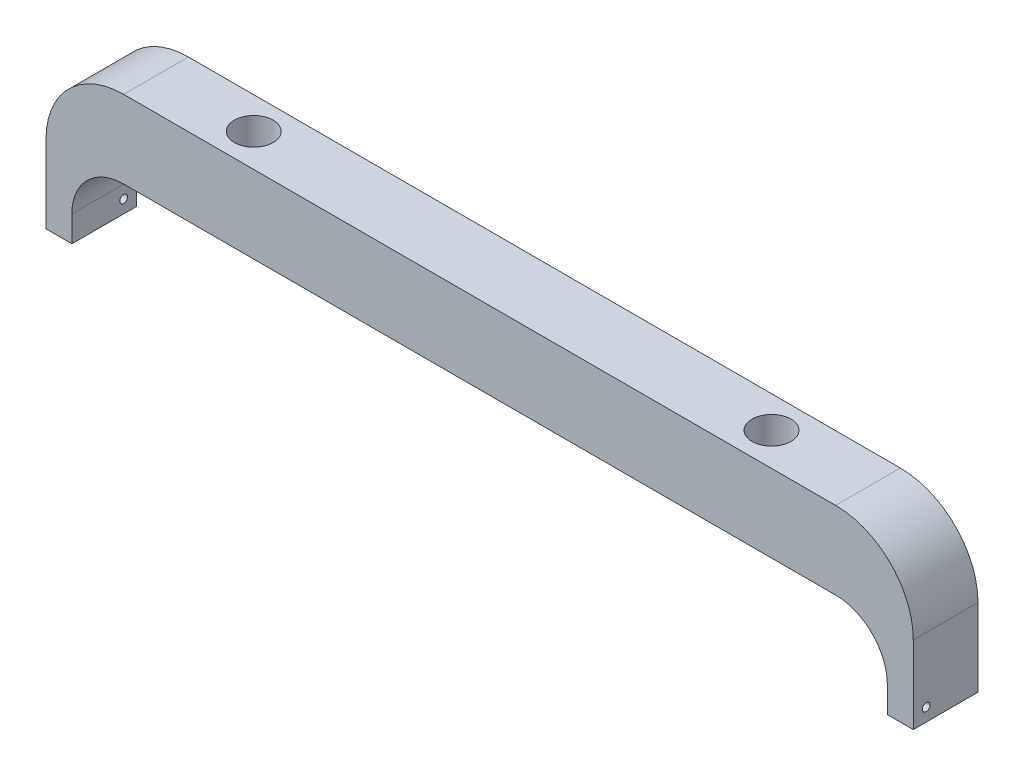
ISO-10303-21;
HEADER;
FILE_DESCRIPTION(('STEP AP214'),'2;1');
FILE_NAME('part.step','',(''),(''),'','','');
FILE_SCHEMA(('AUTOMOTIVE_DESIGN { 1 0 10303 214 1 1 1 1 }'));
ENDSEC;
DATA;
#1=APPLICATION_CONTEXT('core data for automotive mechanical design processes');
#2=APPLICATION_PROTOCOL_DEFINITION('international standard','automotive_design',2000,#1);
#3=PRODUCT_CONTEXT('',#1,'mechanical');
#4=PRODUCT('Part','Part','',(#3));
#5=PRODUCT_RELATED_PRODUCT_CATEGORY('part','',(#4));
#6=PRODUCT_DEFINITION_FORMATION('','',#4);
#7=PRODUCT_DEFINITION_CONTEXT('part definition',#1,'design');
#8=PRODUCT_DEFINITION('design','',#6,#7);
#9=PRODUCT_DEFINITION_SHAPE('','',#8);
#10=(LENGTH_UNIT() NAMED_UNIT(*) SI_UNIT(.MILLI.,.METRE.));
#11=(NAMED_UNIT(*) PLANE_ANGLE_UNIT() SI_UNIT($,.RADIAN.));
#12=(NAMED_UNIT(*) SI_UNIT($,.STERADIAN.) SOLID_ANGLE_UNIT());
#13=UNCERTAINTY_MEASURE_WITH_UNIT(LENGTH_MEASURE(1.E-05),#10,'distance_accuracy_value','');
#14=(GEOMETRIC_REPRESENTATION_CONTEXT(3) GLOBAL_UNCERTAINTY_ASSIGNED_CONTEXT((#13)) GLOBAL_UNIT_ASSIGNED_CONTEXT((#10,
#11,#12)) REPRESENTATION_CONTEXT('',''));
#15=CARTESIAN_POINT('',(0.,0.,0.));
#16=DIRECTION('',(0.,0.,1.));
#17=DIRECTION('',(1.,0.,0.));
#18=AXIS2_PLACEMENT_3D('',#15,#16,#17);
#19=CARTESIAN_POINT('',(0.,-6.,5.));
#20=DIRECTION('',(0.,1.,0.));
#21=DIRECTION('',(0.,0.,1.));
#22=AXIS2_PLACEMENT_3D('',#19,#20,#21);
#23=PLANE('',#22);
#24=CARTESIAN_POINT('',(20.,-6.,2.45));
#25=DIRECTION('',(0.,1.,0.));
#26=DIRECTION('',(0.,0.,1.));
#27=AXIS2_PLACEMENT_3D('',#24,#25,#26);
#28=CIRCLE('',#27,1.5);
#29=CARTESIAN_POINT('',(20.,-6.,3.95));
#30=VERTEX_POINT('',#29);
#31=EDGE_CURVE('E265',#30,#30,#28,.T.);
#32=ORIENTED_EDGE('',*,*,#31,.T.);
#33=EDGE_LOOP('',(#32));
#34=FACE_BOUND('',#33,.T.);
#35=CARTESIAN_POINT('',(-20.,-6.,2.45));
#36=DIRECTION('',(0.,1.,0.));
#37=DIRECTION('',(0.,0.,1.));
#38=AXIS2_PLACEMENT_3D('',#35,#36,#37);
#39=CIRCLE('',#38,1.5);
#40=CARTESIAN_POINT('',(-20.,-6.,3.95));
#41=VERTEX_POINT('',#40);
#42=EDGE_CURVE('E268',#41,#41,#39,.T.);
#43=ORIENTED_EDGE('',*,*,#42,.T.);
#44=EDGE_LOOP('',(#43));
#45=FACE_BOUND('',#44,.T.);
#46=DIRECTION('',(1.,0.,0.));
#47=VECTOR('',#46,1.);
#48=CARTESIAN_POINT('',(0.,-6.,0.));
#49=LINE('',#48,#47);
#50=CARTESIAN_POINT('',(-27.5,-6.,0.));
#51=VERTEX_POINT('',#50);
#52=CARTESIAN_POINT('',(27.5,-6.,0.));
#53=VERTEX_POINT('',#52);
#54=EDGE_CURVE('E156',#51,#53,#49,.T.);
#55=ORIENTED_EDGE('',*,*,#54,.T.);
#56=DIRECTION('',(0.,0.,-1.));
#57=VECTOR('',#56,1.);
#58=CARTESIAN_POINT('',(27.5,-6.,5.));
#59=LINE('',#58,#57);
#60=CARTESIAN_POINT('',(27.5,-6.,5.));
#61=VERTEX_POINT('',#60);
#62=EDGE_CURVE('E11',#61,#53,#59,.T.);
#63=ORIENTED_EDGE('',*,*,#62,.F.);
#64=DIRECTION('',(1.,0.,0.));
#65=VECTOR('',#64,1.);
#66=CARTESIAN_POINT('',(0.,-6.,5.));
#67=LINE('',#66,#65);
#68=CARTESIAN_POINT('',(-27.5,-6.,5.));
#69=VERTEX_POINT('',#68);
#70=EDGE_CURVE('E187',#69,#61,#67,.T.);
#71=ORIENTED_EDGE('',*,*,#70,.F.);
#72=DIRECTION('',(0.,0.,-1.));
#73=VECTOR('',#72,1.);
#74=CARTESIAN_POINT('',(-27.5,-6.,5.));
#75=LINE('',#74,#73);
#76=EDGE_CURVE('E51',#69,#51,#75,.T.);
#77=ORIENTED_EDGE('',*,*,#76,.T.);
#78=EDGE_LOOP('',(#55,#63,#71,#77));
#79=FACE_BOUND('',#78,.T.);
#80=ADVANCED_FACE('F35',(#34,#45,#79),#23,.F.);
#81=CARTESIAN_POINT('',(27.5,-10.,5.));
#82=DIRECTION('',(0.,0.,-1.));
#83=DIRECTION('',(-1.,0.,0.));
#84=AXIS2_PLACEMENT_3D('',#81,#82,#83);
#85=CYLINDRICAL_SURFACE('',#84,4.);
#86=CARTESIAN_POINT('',(27.5,-10.,0.));
#87=DIRECTION('',(0.,0.,1.));
#88=DIRECTION('',(1.,0.,0.));
#89=AXIS2_PLACEMENT_3D('',#86,#87,#88);
#90=CIRCLE('',#89,4.);
#91=CARTESIAN_POINT('',(31.5,-10.,0.));
#92=VERTEX_POINT('',#91);
#93=EDGE_CURVE('E158',#53,#92,#90,.F.);
#94=ORIENTED_EDGE('',*,*,#93,.T.);
#95=DIRECTION('',(0.,0.,-1.));
#96=VECTOR('',#95,1.);
#97=CARTESIAN_POINT('',(31.5,-10.,5.));
#98=LINE('',#97,#96);
#99=CARTESIAN_POINT('',(31.5,-10.,5.));
#100=VERTEX_POINT('',#99);
#101=EDGE_CURVE('E43',#100,#92,#98,.T.);
#102=ORIENTED_EDGE('',*,*,#101,.F.);
#103=CARTESIAN_POINT('',(27.5,-10.,5.));
#104=DIRECTION('',(0.,0.,1.));
#105=DIRECTION('',(1.,0.,0.));
#106=AXIS2_PLACEMENT_3D('',#103,#104,#105);
#107=CIRCLE('',#106,4.);
#108=EDGE_CURVE('E102',#61,#100,#107,.F.);
#109=ORIENTED_EDGE('',*,*,#108,.F.);
#110=ORIENTED_EDGE('',*,*,#62,.T.);
#111=EDGE_LOOP('',(#94,#102,#109,#110));
#112=FACE_BOUND('',#111,.T.);
#113=ADVANCED_FACE('F209',(#112),#85,.F.);
#114=CARTESIAN_POINT('',(31.5,0.,5.));
#115=DIRECTION('',(-1.,0.,0.));
#116=DIRECTION('',(0.,0.,1.));
#117=AXIS2_PLACEMENT_3D('',#114,#115,#116);
#118=PLANE('',#117);
#119=CARTESIAN_POINT('',(31.5,-11.,4.));
#120=DIRECTION('',(1.,0.,0.));
#121=DIRECTION('',(0.,0.,-1.));
#122=AXIS2_PLACEMENT_3D('',#119,#120,#121);
#123=CIRCLE('',#122,0.3);
#124=CARTESIAN_POINT('',(31.5,-11.,3.7));
#125=VERTEX_POINT('',#124);
#126=EDGE_CURVE('E159',#125,#125,#123,.T.);
#127=ORIENTED_EDGE('',*,*,#126,.T.);
#128=EDGE_LOOP('',(#127));
#129=FACE_BOUND('',#128,.T.);
#130=DIRECTION('',(0.,1.,0.));
#131=VECTOR('',#130,1.);
#132=CARTESIAN_POINT('',(31.5,0.,0.));
#133=LINE('',#132,#131);
#134=CARTESIAN_POINT('',(31.5,-12.,0.));
#135=VERTEX_POINT('',#134);
#136=EDGE_CURVE('E162',#135,#92,#133,.T.);
#137=ORIENTED_EDGE('',*,*,#136,.F.);
#138=DIRECTION('',(0.,0.,-1.));
#139=VECTOR('',#138,1.);
#140=CARTESIAN_POINT('',(31.5,-12.,5.));
#141=LINE('',#140,#139);
#142=CARTESIAN_POINT('',(31.5,-12.,5.));
#143=VERTEX_POINT('',#142);
#144=EDGE_CURVE('E202',#143,#135,#141,.T.);
#145=ORIENTED_EDGE('',*,*,#144,.F.);
#146=DIRECTION('',(0.,1.,0.));
#147=VECTOR('',#146,1.);
#148=CARTESIAN_POINT('',(31.5,0.,5.));
#149=LINE('',#148,#147);
#150=EDGE_CURVE('E208',#143,#100,#149,.T.);
#151=ORIENTED_EDGE('',*,*,#150,.T.);
#152=ORIENTED_EDGE('',*,*,#101,.T.);
#153=EDGE_LOOP('',(#137,#145,#151,#152));
#154=FACE_BOUND('',#153,.T.);
#155=ADVANCED_FACE('F206',(#129,#154),#118,.T.);
#156=CARTESIAN_POINT('',(0.,-12.,5.));
#157=DIRECTION('',(0.,-1.,0.));
#158=DIRECTION('',(0.,0.,-1.));
#159=AXIS2_PLACEMENT_3D('',#156,#157,#158);
#160=PLANE('',#159);
#161=DIRECTION('',(-1.,0.,0.));
#162=VECTOR('',#161,1.);
#163=CARTESIAN_POINT('',(0.,-12.,0.));
#164=LINE('',#163,#162);
#165=CARTESIAN_POINT('',(33.5,-12.,0.));
#166=VERTEX_POINT('',#165);
#167=EDGE_CURVE('E165',#166,#135,#164,.T.);
#168=ORIENTED_EDGE('',*,*,#167,.F.);
#169=DIRECTION('',(0.,0.,-1.));
#170=VECTOR('',#169,1.);
#171=CARTESIAN_POINT('',(33.5,-12.,5.));
#172=LINE('',#171,#170);
#173=CARTESIAN_POINT('',(33.5,-12.,5.));
#174=VERTEX_POINT('',#173);
#175=EDGE_CURVE('E200',#174,#166,#172,.T.);
#176=ORIENTED_EDGE('',*,*,#175,.F.);
#177=DIRECTION('',(-1.,0.,0.));
#178=VECTOR('',#177,1.);
#179=CARTESIAN_POINT('',(0.,-12.,5.));
#180=LINE('',#179,#178);
#181=EDGE_CURVE('E219',#174,#143,#180,.T.);
#182=ORIENTED_EDGE('',*,*,#181,.T.);
#183=ORIENTED_EDGE('',*,*,#144,.T.);
#184=EDGE_LOOP('',(#168,#176,#182,#183));
#185=FACE_BOUND('',#184,.T.);
#186=ADVANCED_FACE('F216',(#185),#160,.T.);
#187=CARTESIAN_POINT('',(33.5,0.,5.));
#188=DIRECTION('',(1.,0.,0.));
#189=DIRECTION('',(0.,0.,-1.));
#190=AXIS2_PLACEMENT_3D('',#187,#188,#189);
#191=PLANE('',#190);
#192=CARTESIAN_POINT('',(33.5,-11.,4.));
#193=DIRECTION('',(1.,0.,0.));
#194=DIRECTION('',(0.,0.,-1.));
#195=AXIS2_PLACEMENT_3D('',#192,#193,#194);
#196=CIRCLE('',#195,0.3);
#197=CARTESIAN_POINT('',(33.5,-11.,3.7));
#198=VERTEX_POINT('',#197);
#199=EDGE_CURVE('E270',#198,#198,#196,.T.);
#200=ORIENTED_EDGE('',*,*,#199,.F.);
#201=EDGE_LOOP('',(#200));
#202=FACE_BOUND('',#201,.T.);
#203=DIRECTION('',(0.,-1.,0.));
#204=VECTOR('',#203,1.);
#205=CARTESIAN_POINT('',(33.5,0.,0.));
#206=LINE('',#205,#204);
#207=CARTESIAN_POINT('',(33.5,-6.,0.));
#208=VERTEX_POINT('',#207);
#209=EDGE_CURVE('E168',#208,#166,#206,.T.);
#210=ORIENTED_EDGE('',*,*,#209,.F.);
#211=DIRECTION('',(0.,0.,-1.));
#212=VECTOR('',#211,1.);
#213=CARTESIAN_POINT('',(33.5,-6.,5.));
#214=LINE('',#213,#212);
#215=CARTESIAN_POINT('',(33.5,-6.,5.));
#216=VERTEX_POINT('',#215);
#217=EDGE_CURVE('E198',#216,#208,#214,.T.);
#218=ORIENTED_EDGE('',*,*,#217,.F.);
#219=DIRECTION('',(0.,-1.,0.));
#220=VECTOR('',#219,1.);
#221=CARTESIAN_POINT('',(33.5,0.,5.));
#222=LINE('',#221,#220);
#223=EDGE_CURVE('E223',#216,#174,#222,.T.);
#224=ORIENTED_EDGE('',*,*,#223,.T.);
#225=ORIENTED_EDGE('',*,*,#175,.T.);
#226=EDGE_LOOP('',(#210,#218,#224,#225));
#227=FACE_BOUND('',#226,.T.);
#228=ADVANCED_FACE('F304',(#202,#227),#191,.T.);
#229=CARTESIAN_POINT('',(27.5,-6.,5.));
#230=DIRECTION('',(0.,0.,-1.));
#231=DIRECTION('',(-1.,0.,0.));
#232=AXIS2_PLACEMENT_3D('',#229,#230,#231);
#233=CYLINDRICAL_SURFACE('',#232,6.);
#234=CARTESIAN_POINT('',(27.5,-6.,0.));
#235=DIRECTION('',(0.,0.,1.));
#236=DIRECTION('',(1.,0.,0.));
#237=AXIS2_PLACEMENT_3D('',#234,#235,#236);
#238=CIRCLE('',#237,6.);
#239=CARTESIAN_POINT('',(27.5,0.,0.));
#240=VERTEX_POINT('',#239);
#241=EDGE_CURVE('E171',#240,#208,#238,.F.);
#242=ORIENTED_EDGE('',*,*,#241,.F.);
#243=DIRECTION('',(0.,0.,-1.));
#244=VECTOR('',#243,1.);
#245=CARTESIAN_POINT('',(27.5,0.,5.));
#246=LINE('',#245,#244);
#247=CARTESIAN_POINT('',(27.5,0.,5.));
#248=VERTEX_POINT('',#247);
#249=EDGE_CURVE('E196',#248,#240,#246,.T.);
#250=ORIENTED_EDGE('',*,*,#249,.F.);
#251=CARTESIAN_POINT('',(27.5,-6.,5.));
#252=DIRECTION('',(0.,0.,1.));
#253=DIRECTION('',(1.,0.,0.));
#254=AXIS2_PLACEMENT_3D('',#251,#252,#253);
#255=CIRCLE('',#254,6.);
#256=EDGE_CURVE('E229',#248,#216,#255,.F.);
#257=ORIENTED_EDGE('',*,*,#256,.T.);
#258=ORIENTED_EDGE('',*,*,#217,.T.);
#259=EDGE_LOOP('',(#242,#250,#257,#258));
#260=FACE_BOUND('',#259,.T.);
#261=ADVANCED_FACE('F296',(#260),#233,.T.);
#262=CARTESIAN_POINT('',(0.,0.,5.));
#263=DIRECTION('',(0.,1.,0.));
#264=DIRECTION('',(0.,0.,1.));
#265=AXIS2_PLACEMENT_3D('',#262,#263,#264);
#266=PLANE('',#265);
#267=CARTESIAN_POINT('',(20.,0.,2.45));
#268=DIRECTION('',(0.,1.,0.));
#269=DIRECTION('',(0.,0.,-1.));
#270=AXIS2_PLACEMENT_3D('',#267,#268,#269);
#271=CIRCLE('',#270,1.5);
#272=CARTESIAN_POINT('',(20.,0.,0.949999999999999));
#273=VERTEX_POINT('',#272);
#274=EDGE_CURVE('E286',#273,#273,#271,.T.);
#275=ORIENTED_EDGE('',*,*,#274,.F.);
#276=EDGE_LOOP('',(#275));
#277=FACE_BOUND('',#276,.T.);
#278=CARTESIAN_POINT('',(-20.,0.,2.45));
#279=DIRECTION('',(0.,1.,0.));
#280=DIRECTION('',(0.,0.,1.));
#281=AXIS2_PLACEMENT_3D('',#278,#279,#280);
#282=CIRCLE('',#281,1.5);
#283=CARTESIAN_POINT('',(-20.,0.,3.95));
#284=VERTEX_POINT('',#283);
#285=EDGE_CURVE('E282',#284,#284,#282,.T.);
#286=ORIENTED_EDGE('',*,*,#285,.F.);
#287=EDGE_LOOP('',(#286));
#288=FACE_BOUND('',#287,.T.);
#289=DIRECTION('',(1.,0.,0.));
#290=VECTOR('',#289,1.);
#291=CARTESIAN_POINT('',(0.,0.,0.));
#292=LINE('',#291,#290);
#293=CARTESIAN_POINT('',(-27.5,0.,0.));
#294=VERTEX_POINT('',#293);
#295=EDGE_CURVE('E174',#294,#240,#292,.T.);
#296=ORIENTED_EDGE('',*,*,#295,.F.);
#297=DIRECTION('',(0.,0.,-1.));
#298=VECTOR('',#297,1.);
#299=CARTESIAN_POINT('',(-27.5,0.,5.));
#300=LINE('',#299,#298);
#301=CARTESIAN_POINT('',(-27.5,0.,5.));
#302=VERTEX_POINT('',#301);
#303=EDGE_CURVE('E194',#302,#294,#300,.T.);
#304=ORIENTED_EDGE('',*,*,#303,.F.);
#305=DIRECTION('',(1.,0.,0.));
#306=VECTOR('',#305,1.);
#307=CARTESIAN_POINT('',(0.,0.,5.));
#308=LINE('',#307,#306);
#309=EDGE_CURVE('E232',#302,#248,#308,.T.);
#310=ORIENTED_EDGE('',*,*,#309,.T.);
#311=ORIENTED_EDGE('',*,*,#249,.T.);
#312=EDGE_LOOP('',(#296,#304,#310,#311));
#313=FACE_BOUND('',#312,.T.);
#314=ADVANCED_FACE('F293',(#277,#288,#313),#266,.T.);
#315=CARTESIAN_POINT('',(-27.5,-6.,5.));
#316=DIRECTION('',(0.,0.,-1.));
#317=DIRECTION('',(-1.,0.,0.));
#318=AXIS2_PLACEMENT_3D('',#315,#316,#317);
#319=CYLINDRICAL_SURFACE('',#318,6.);
#320=CARTESIAN_POINT('',(-27.5,-6.,0.));
#321=DIRECTION('',(0.,0.,1.));
#322=DIRECTION('',(1.,0.,0.));
#323=AXIS2_PLACEMENT_3D('',#320,#321,#322);
#324=CIRCLE('',#323,6.);
#325=CARTESIAN_POINT('',(-33.5,-6.,0.));
#326=VERTEX_POINT('',#325);
#327=EDGE_CURVE('E177',#294,#326,#324,.T.);
#328=ORIENTED_EDGE('',*,*,#327,.T.);
#329=DIRECTION('',(0.,0.,-1.));
#330=VECTOR('',#329,1.);
#331=CARTESIAN_POINT('',(-33.5,-6.,5.));
#332=LINE('',#331,#330);
#333=CARTESIAN_POINT('',(-33.5,-6.,5.));
#334=VERTEX_POINT('',#333);
#335=EDGE_CURVE('E191',#334,#326,#332,.T.);
#336=ORIENTED_EDGE('',*,*,#335,.F.);
#337=CARTESIAN_POINT('',(-27.5,-6.,5.));
#338=DIRECTION('',(0.,0.,1.));
#339=DIRECTION('',(1.,0.,0.));
#340=AXIS2_PLACEMENT_3D('',#337,#338,#339);
#341=CIRCLE('',#340,6.);
#342=EDGE_CURVE('E235',#302,#334,#341,.T.);
#343=ORIENTED_EDGE('',*,*,#342,.F.);
#344=ORIENTED_EDGE('',*,*,#303,.T.);
#345=EDGE_LOOP('',(#328,#336,#343,#344));
#346=FACE_BOUND('',#345,.T.);
#347=ADVANCED_FACE('F241',(#346),#319,.T.);
#348=CARTESIAN_POINT('',(-33.5,0.,5.));
#349=DIRECTION('',(1.,0.,0.));
#350=DIRECTION('',(0.,0.,-1.));
#351=AXIS2_PLACEMENT_3D('',#348,#349,#350);
#352=PLANE('',#351);
#353=CARTESIAN_POINT('',(-33.5,-11.,1.));
#354=DIRECTION('',(-1.,0.,0.));
#355=DIRECTION('',(0.,0.,1.));
#356=AXIS2_PLACEMENT_3D('',#353,#354,#355);
#357=CIRCLE('',#356,0.3);
#358=CARTESIAN_POINT('',(-33.5,-11.,1.3));
#359=VERTEX_POINT('',#358);
#360=EDGE_CURVE('E276',#359,#359,#357,.T.);
#361=ORIENTED_EDGE('',*,*,#360,.F.);
#362=EDGE_LOOP('',(#361));
#363=FACE_BOUND('',#362,.T.);
#364=DIRECTION('',(0.,-1.,0.));
#365=VECTOR('',#364,1.);
#366=CARTESIAN_POINT('',(-33.5,0.,0.));
#367=LINE('',#366,#365);
#368=CARTESIAN_POINT('',(-33.5,-12.,0.));
#369=VERTEX_POINT('',#368);
#370=EDGE_CURVE('E179',#326,#369,#367,.T.);
#371=ORIENTED_EDGE('',*,*,#370,.T.);
#372=DIRECTION('',(0.,0.,-1.));
#373=VECTOR('',#372,1.);
#374=CARTESIAN_POINT('',(-33.5,-12.,5.));
#375=LINE('',#374,#373);
#376=CARTESIAN_POINT('',(-33.5,-12.,5.));
#377=VERTEX_POINT('',#376);
#378=EDGE_CURVE('E148',#377,#369,#375,.T.);
#379=ORIENTED_EDGE('',*,*,#378,.F.);
#380=DIRECTION('',(0.,-1.,0.));
#381=VECTOR('',#380,1.);
#382=CARTESIAN_POINT('',(-33.5,0.,5.));
#383=LINE('',#382,#381);
#384=EDGE_CURVE('E136',#334,#377,#383,.T.);
#385=ORIENTED_EDGE('',*,*,#384,.F.);
#386=ORIENTED_EDGE('',*,*,#335,.T.);
#387=EDGE_LOOP('',(#371,#379,#385,#386));
#388=FACE_BOUND('',#387,.T.);
#389=ADVANCED_FACE('F245',(#363,#388),#352,.F.);
#390=CARTESIAN_POINT('',(0.,-12.,5.));
#391=DIRECTION('',(0.,1.,0.));
#392=DIRECTION('',(0.,0.,1.));
#393=AXIS2_PLACEMENT_3D('',#390,#391,#392);
#394=PLANE('',#393);
#395=DIRECTION('',(1.,0.,0.));
#396=VECTOR('',#395,1.);
#397=CARTESIAN_POINT('',(0.,-12.,0.));
#398=LINE('',#397,#396);
#399=CARTESIAN_POINT('',(-31.5,-12.,0.));
#400=VERTEX_POINT('',#399);
#401=EDGE_CURVE('E145',#369,#400,#398,.T.);
#402=ORIENTED_EDGE('',*,*,#401,.T.);
#403=DIRECTION('',(0.,0.,-1.));
#404=VECTOR('',#403,1.);
#405=CARTESIAN_POINT('',(-31.5,-12.,5.));
#406=LINE('',#405,#404);
#407=CARTESIAN_POINT('',(-31.5,-12.,5.));
#408=VERTEX_POINT('',#407);
#409=EDGE_CURVE('E142',#408,#400,#406,.T.);
#410=ORIENTED_EDGE('',*,*,#409,.F.);
#411=DIRECTION('',(1.,0.,0.));
#412=VECTOR('',#411,1.);
#413=CARTESIAN_POINT('',(0.,-12.,5.));
#414=LINE('',#413,#412);
#415=EDGE_CURVE('E129',#377,#408,#414,.T.);
#416=ORIENTED_EDGE('',*,*,#415,.F.);
#417=ORIENTED_EDGE('',*,*,#378,.T.);
#418=EDGE_LOOP('',(#402,#410,#416,#417));
#419=FACE_BOUND('',#418,.T.);
#420=ADVANCED_FACE('F143',(#419),#394,.F.);
#421=CARTESIAN_POINT('',(-31.5,0.,5.));
#422=DIRECTION('',(-1.,0.,0.));
#423=DIRECTION('',(0.,0.,1.));
#424=AXIS2_PLACEMENT_3D('',#421,#422,#423);
#425=PLANE('',#424);
#426=CARTESIAN_POINT('',(-31.5,-11.,1.));
#427=DIRECTION('',(-1.,0.,0.));
#428=DIRECTION('',(0.,0.,1.));
#429=AXIS2_PLACEMENT_3D('',#426,#427,#428);
#430=CIRCLE('',#429,0.3);
#431=CARTESIAN_POINT('',(-31.5,-11.,1.3));
#432=VERTEX_POINT('',#431);
#433=EDGE_CURVE('E273',#432,#432,#430,.T.);
#434=ORIENTED_EDGE('',*,*,#433,.T.);
#435=EDGE_LOOP('',(#434));
#436=FACE_BOUND('',#435,.T.);
#437=DIRECTION('',(0.,1.,0.));
#438=VECTOR('',#437,1.);
#439=CARTESIAN_POINT('',(-31.5,0.,0.));
#440=LINE('',#439,#438);
#441=CARTESIAN_POINT('',(-31.5,-10.,0.));
#442=VERTEX_POINT('',#441);
#443=EDGE_CURVE('E182',#400,#442,#440,.T.);
#444=ORIENTED_EDGE('',*,*,#443,.T.);
#445=DIRECTION('',(0.,0.,-1.));
#446=VECTOR('',#445,1.);
#447=CARTESIAN_POINT('',(-31.5,-10.,5.));
#448=LINE('',#447,#446);
#449=CARTESIAN_POINT('',(-31.5,-10.,5.));
#450=VERTEX_POINT('',#449);
#451=EDGE_CURVE('E90',#450,#442,#448,.T.);
#452=ORIENTED_EDGE('',*,*,#451,.F.);
#453=DIRECTION('',(0.,1.,0.));
#454=VECTOR('',#453,1.);
#455=CARTESIAN_POINT('',(-31.5,0.,5.));
#456=LINE('',#455,#454);
#457=EDGE_CURVE('E134',#408,#450,#456,.T.);
#458=ORIENTED_EDGE('',*,*,#457,.F.);
#459=ORIENTED_EDGE('',*,*,#409,.T.);
#460=EDGE_LOOP('',(#444,#452,#458,#459));
#461=FACE_BOUND('',#460,.T.);
#462=ADVANCED_FACE('F150',(#436,#461),#425,.F.);
#463=CARTESIAN_POINT('',(-27.5,-10.,5.));
#464=DIRECTION('',(0.,0.,-1.));
#465=DIRECTION('',(-1.,0.,0.));
#466=AXIS2_PLACEMENT_3D('',#463,#464,#465);
#467=CYLINDRICAL_SURFACE('',#466,4.);
#468=CARTESIAN_POINT('',(-27.5,-10.,0.));
#469=DIRECTION('',(0.,0.,1.));
#470=DIRECTION('',(1.,0.,0.));
#471=AXIS2_PLACEMENT_3D('',#468,#469,#470);
#472=CIRCLE('',#471,4.);
#473=EDGE_CURVE('E184',#51,#442,#472,.T.);
#474=ORIENTED_EDGE('',*,*,#473,.F.);
#475=ORIENTED_EDGE('',*,*,#76,.F.);
#476=CARTESIAN_POINT('',(-27.5,-10.,5.));
#477=DIRECTION('',(0.,0.,1.));
#478=DIRECTION('',(1.,0.,0.));
#479=AXIS2_PLACEMENT_3D('',#476,#477,#478);
#480=CIRCLE('',#479,4.);
#481=EDGE_CURVE('E151',#69,#450,#480,.T.);
#482=ORIENTED_EDGE('',*,*,#481,.T.);
#483=ORIENTED_EDGE('',*,*,#451,.T.);
#484=EDGE_LOOP('',(#474,#475,#482,#483));
#485=FACE_BOUND('',#484,.T.);
#486=ADVANCED_FACE('F246',(#485),#467,.F.);
#487=CARTESIAN_POINT('',(0.,0.,5.));
#488=DIRECTION('',(0.,0.,1.));
#489=DIRECTION('',(1.,0.,0.));
#490=AXIS2_PLACEMENT_3D('',#487,#488,#489);
#491=PLANE('',#490);
#492=ORIENTED_EDGE('',*,*,#70,.T.);
#493=ORIENTED_EDGE('',*,*,#108,.T.);
#494=ORIENTED_EDGE('',*,*,#150,.F.);
#495=ORIENTED_EDGE('',*,*,#181,.F.);
#496=ORIENTED_EDGE('',*,*,#223,.F.);
#497=ORIENTED_EDGE('',*,*,#256,.F.);
#498=ORIENTED_EDGE('',*,*,#309,.F.);
#499=ORIENTED_EDGE('',*,*,#342,.T.);
#500=ORIENTED_EDGE('',*,*,#384,.T.);
#501=ORIENTED_EDGE('',*,*,#415,.T.);
#502=ORIENTED_EDGE('',*,*,#457,.T.);
#503=ORIENTED_EDGE('',*,*,#481,.F.);
#504=EDGE_LOOP('',(#492,#493,#494,#495,#496,#497,#498,#499,#500,#501,#502,#503));
#505=FACE_BOUND('',#504,.T.);
#506=ADVANCED_FACE('F131',(#505),#491,.T.);
#507=CARTESIAN_POINT('',(0.,0.,0.));
#508=DIRECTION('',(0.,0.,1.));
#509=DIRECTION('',(1.,0.,0.));
#510=AXIS2_PLACEMENT_3D('',#507,#508,#509);
#511=PLANE('',#510);
#512=ORIENTED_EDGE('',*,*,#54,.F.);
#513=ORIENTED_EDGE('',*,*,#473,.T.);
#514=ORIENTED_EDGE('',*,*,#443,.F.);
#515=ORIENTED_EDGE('',*,*,#401,.F.);
#516=ORIENTED_EDGE('',*,*,#370,.F.);
#517=ORIENTED_EDGE('',*,*,#327,.F.);
#518=ORIENTED_EDGE('',*,*,#295,.T.);
#519=ORIENTED_EDGE('',*,*,#241,.T.);
#520=ORIENTED_EDGE('',*,*,#209,.T.);
#521=ORIENTED_EDGE('',*,*,#167,.T.);
#522=ORIENTED_EDGE('',*,*,#136,.T.);
#523=ORIENTED_EDGE('',*,*,#93,.F.);
#524=EDGE_LOOP('',(#512,#513,#514,#515,#516,#517,#518,#519,#520,#521,#522,#523));
#525=FACE_BOUND('',#524,.T.);
#526=ADVANCED_FACE('F212',(#525),#511,.F.);
#527=CARTESIAN_POINT('',(31.5,-11.,4.));
#528=DIRECTION('',(1.,0.,0.));
#529=DIRECTION('',(0.,0.,-1.));
#530=AXIS2_PLACEMENT_3D('',#527,#528,#529);
#531=CYLINDRICAL_SURFACE('',#530,0.3);
#532=ORIENTED_EDGE('',*,*,#126,.F.);
#533=EDGE_LOOP('',(#532));
#534=FACE_BOUND('',#533,.T.);
#535=ORIENTED_EDGE('',*,*,#199,.T.);
#536=EDGE_LOOP('',(#535));
#537=FACE_BOUND('',#536,.T.);
#538=ADVANCED_FACE('F322',(#534,#537),#531,.F.);
#539=CARTESIAN_POINT('',(-31.5,-11.,1.));
#540=DIRECTION('',(-1.,0.,0.));
#541=DIRECTION('',(0.,0.,1.));
#542=AXIS2_PLACEMENT_3D('',#539,#540,#541);
#543=CYLINDRICAL_SURFACE('',#542,0.3);
#544=ORIENTED_EDGE('',*,*,#433,.F.);
#545=EDGE_LOOP('',(#544));
#546=FACE_BOUND('',#545,.T.);
#547=ORIENTED_EDGE('',*,*,#360,.T.);
#548=EDGE_LOOP('',(#547));
#549=FACE_BOUND('',#548,.T.);
#550=ADVANCED_FACE('F325',(#546,#549),#543,.F.);
#551=CARTESIAN_POINT('',(-20.,-10.,2.45));
#552=DIRECTION('',(0.,1.,0.));
#553=DIRECTION('',(0.,0.,1.));
#554=AXIS2_PLACEMENT_3D('',#551,#552,#553);
#555=CYLINDRICAL_SURFACE('',#554,1.5);
#556=ORIENTED_EDGE('',*,*,#285,.T.);
#557=EDGE_LOOP('',(#556));
#558=FACE_BOUND('',#557,.T.);
#559=ORIENTED_EDGE('',*,*,#42,.F.);
#560=EDGE_LOOP('',(#559));
#561=FACE_BOUND('',#560,.T.);
#562=ADVANCED_FACE('F331',(#558,#561),#555,.F.);
#563=CARTESIAN_POINT('',(20.,-10.,2.45));
#564=DIRECTION('',(0.,1.,0.));
#565=DIRECTION('',(0.,0.,1.));
#566=AXIS2_PLACEMENT_3D('',#563,#564,#565);
#567=CYLINDRICAL_SURFACE('',#566,1.5);
#568=ORIENTED_EDGE('',*,*,#274,.T.);
#569=EDGE_LOOP('',(#568));
#570=FACE_BOUND('',#569,.T.);
#571=ORIENTED_EDGE('',*,*,#31,.F.);
#572=EDGE_LOOP('',(#571));
#573=FACE_BOUND('',#572,.T.);
#574=ADVANCED_FACE('F290',(#570,#573),#567,.F.);
#575=CLOSED_SHELL('',(#80,#113,#155,#186,#228,#261,#314,#347,#389,#420,#462,#486,#506,#526,#538,
#550,#562,#574));
#576=MANIFOLD_SOLID_BREP('B2',#575);
#577=ADVANCED_BREP_SHAPE_REPRESENTATION('',(#18,#576),#14);
#578=SHAPE_DEFINITION_REPRESENTATION(#9,#577);
ENDSEC;
END-ISO-10303-21;
